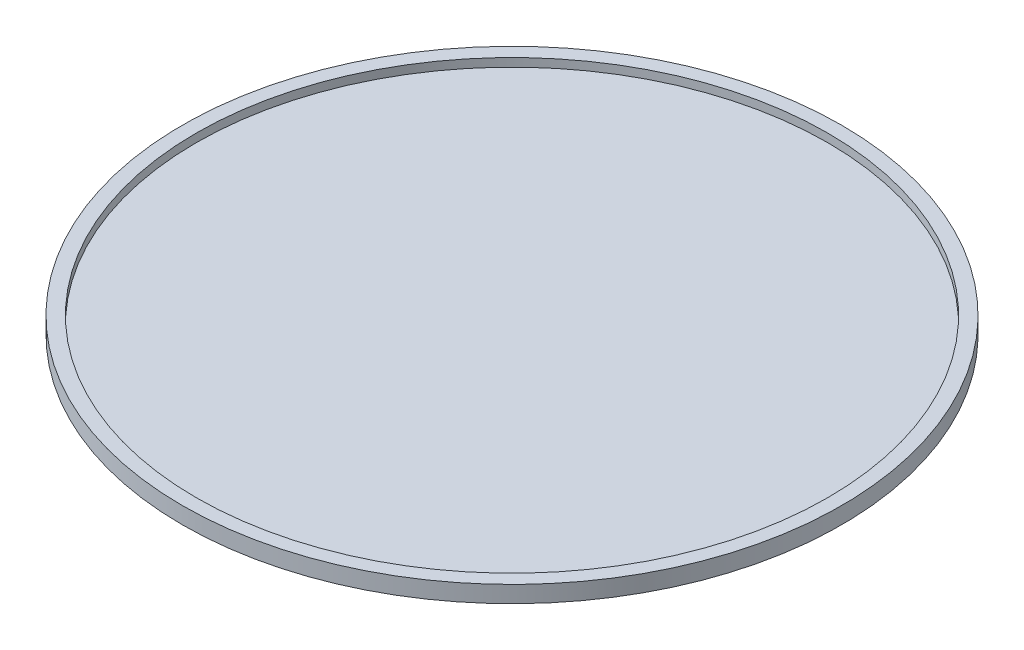
ISO-10303-21;
HEADER;
FILE_DESCRIPTION(('STEP AP214'),'2;1');
FILE_NAME('part.step','',(''),(''),'','','');
FILE_SCHEMA(('AUTOMOTIVE_DESIGN { 1 0 10303 214 1 1 1 1 }'));
ENDSEC;
DATA;
#1=APPLICATION_CONTEXT('core data for automotive mechanical design processes');
#2=APPLICATION_PROTOCOL_DEFINITION('international standard','automotive_design',2000,#1);
#3=PRODUCT_CONTEXT('',#1,'mechanical');
#4=PRODUCT('Part','Part','',(#3));
#5=PRODUCT_RELATED_PRODUCT_CATEGORY('part','',(#4));
#6=PRODUCT_DEFINITION_FORMATION('','',#4);
#7=PRODUCT_DEFINITION_CONTEXT('part definition',#1,'design');
#8=PRODUCT_DEFINITION('design','',#6,#7);
#9=PRODUCT_DEFINITION_SHAPE('','',#8);
#10=(LENGTH_UNIT() NAMED_UNIT(*) SI_UNIT(.MILLI.,.METRE.));
#11=(NAMED_UNIT(*) PLANE_ANGLE_UNIT() SI_UNIT($,.RADIAN.));
#12=(NAMED_UNIT(*) SI_UNIT($,.STERADIAN.) SOLID_ANGLE_UNIT());
#13=UNCERTAINTY_MEASURE_WITH_UNIT(LENGTH_MEASURE(1.E-05),#10,'distance_accuracy_value','');
#14=(GEOMETRIC_REPRESENTATION_CONTEXT(3) GLOBAL_UNCERTAINTY_ASSIGNED_CONTEXT((#13)) GLOBAL_UNIT_ASSIGNED_CONTEXT((#10,
#11,#12)) REPRESENTATION_CONTEXT('',''));
#15=CARTESIAN_POINT('',(0.,0.,0.));
#16=DIRECTION('',(0.,0.,1.));
#17=DIRECTION('',(1.,0.,0.));
#18=AXIS2_PLACEMENT_3D('',#15,#16,#17);
#19=CARTESIAN_POINT('',(0.,5.08,0.));
#20=DIRECTION('',(0.,-1.,0.));
#21=DIRECTION('',(0.,0.,-1.));
#22=AXIS2_PLACEMENT_3D('',#19,#20,#21);
#23=CYLINDRICAL_SURFACE('',#22,100.33);
#24=CARTESIAN_POINT('',(0.,5.08,0.));
#25=DIRECTION('',(0.,1.,0.));
#26=DIRECTION('',(0.,0.,1.));
#27=AXIS2_PLACEMENT_3D('',#24,#25,#26);
#28=CIRCLE('',#27,100.33);
#29=CARTESIAN_POINT('',(0.,5.08,100.33));
#30=VERTEX_POINT('',#29);
#31=EDGE_CURVE('E10',#30,#30,#28,.T.);
#32=ORIENTED_EDGE('',*,*,#31,.F.);
#33=EDGE_LOOP('',(#32));
#34=FACE_BOUND('',#33,.T.);
#35=CARTESIAN_POINT('',(0.,0.,0.));
#36=DIRECTION('',(0.,1.,0.));
#37=DIRECTION('',(0.,0.,1.));
#38=AXIS2_PLACEMENT_3D('',#35,#36,#37);
#39=CIRCLE('',#38,100.33);
#40=CARTESIAN_POINT('',(0.,0.,100.33));
#41=VERTEX_POINT('',#40);
#42=EDGE_CURVE('E48',#41,#41,#39,.T.);
#43=ORIENTED_EDGE('',*,*,#42,.T.);
#44=EDGE_LOOP('',(#43));
#45=FACE_BOUND('',#44,.T.);
#46=ADVANCED_FACE('F45',(#34,#45),#23,.T.);
#47=CARTESIAN_POINT('',(0.,5.08,0.));
#48=DIRECTION('',(0.,1.,0.));
#49=DIRECTION('',(0.,0.,1.));
#50=AXIS2_PLACEMENT_3D('',#47,#48,#49);
#51=PLANE('',#50);
#52=CARTESIAN_POINT('',(0.,5.08,0.));
#53=DIRECTION('',(0.,1.,0.));
#54=DIRECTION('',(0.,0.,1.));
#55=AXIS2_PLACEMENT_3D('',#52,#53,#54);
#56=CIRCLE('',#55,96.139);
#57=CARTESIAN_POINT('',(0.,5.08,96.139));
#58=VERTEX_POINT('',#57);
#59=EDGE_CURVE('E59',#58,#58,#56,.T.);
#60=ORIENTED_EDGE('',*,*,#59,.F.);
#61=EDGE_LOOP('',(#60));
#62=FACE_BOUND('',#61,.T.);
#63=ORIENTED_EDGE('',*,*,#31,.T.);
#64=EDGE_LOOP('',(#63));
#65=FACE_BOUND('',#64,.T.);
#66=ADVANCED_FACE('F76',(#62,#65),#51,.T.);
#67=CARTESIAN_POINT('',(0.,0.,0.));
#68=DIRECTION('',(0.,1.,0.));
#69=DIRECTION('',(0.,0.,1.));
#70=AXIS2_PLACEMENT_3D('',#67,#68,#69);
#71=PLANE('',#70);
#72=ORIENTED_EDGE('',*,*,#42,.F.);
#73=EDGE_LOOP('',(#72));
#74=FACE_BOUND('',#73,.T.);
#75=ADVANCED_FACE('F72',(#74),#71,.F.);
#76=CARTESIAN_POINT('',(0.,2.54,0.));
#77=DIRECTION('',(0.,1.,0.));
#78=DIRECTION('',(0.,0.,1.));
#79=AXIS2_PLACEMENT_3D('',#76,#77,#78);
#80=CYLINDRICAL_SURFACE('',#79,96.139);
#81=CARTESIAN_POINT('',(0.,2.54,0.));
#82=DIRECTION('',(0.,1.,0.));
#83=DIRECTION('',(0.,0.,1.));
#84=AXIS2_PLACEMENT_3D('',#81,#82,#83);
#85=CIRCLE('',#84,96.139);
#86=CARTESIAN_POINT('',(0.,2.54,96.139));
#87=VERTEX_POINT('',#86);
#88=EDGE_CURVE('E57',#87,#87,#85,.T.);
#89=ORIENTED_EDGE('',*,*,#88,.F.);
#90=EDGE_LOOP('',(#89));
#91=FACE_BOUND('',#90,.T.);
#92=ORIENTED_EDGE('',*,*,#59,.T.);
#93=EDGE_LOOP('',(#92));
#94=FACE_BOUND('',#93,.T.);
#95=ADVANCED_FACE('F69',(#91,#94),#80,.F.);
#96=CARTESIAN_POINT('',(0.,2.54,0.));
#97=DIRECTION('',(0.,1.,0.));
#98=DIRECTION('',(0.,0.,1.));
#99=AXIS2_PLACEMENT_3D('',#96,#97,#98);
#100=PLANE('',#99);
#101=ORIENTED_EDGE('',*,*,#88,.T.);
#102=EDGE_LOOP('',(#101));
#103=FACE_BOUND('',#102,.T.);
#104=ADVANCED_FACE('F67',(#103),#100,.T.);
#105=CLOSED_SHELL('',(#46,#66,#75,#95,#104));
#106=MANIFOLD_SOLID_BREP('B2',#105);
#107=ADVANCED_BREP_SHAPE_REPRESENTATION('',(#18,#106),#14);
#108=SHAPE_DEFINITION_REPRESENTATION(#9,#107);
ENDSEC;
END-ISO-10303-21;
